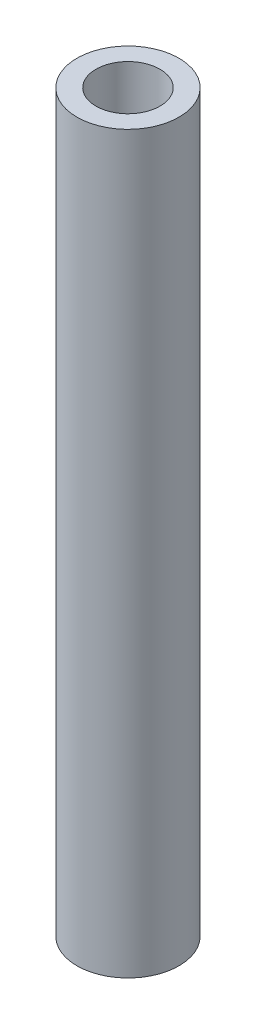
ISO-10303-21;
HEADER;
FILE_DESCRIPTION(('STEP AP214'),'2;1');
FILE_NAME('part.step','',(''),(''),'','','');
FILE_SCHEMA(('AUTOMOTIVE_DESIGN { 1 0 10303 214 1 1 1 1 }'));
ENDSEC;
DATA;
#1=APPLICATION_CONTEXT('core data for automotive mechanical design processes');
#2=APPLICATION_PROTOCOL_DEFINITION('international standard','automotive_design',2000,#1);
#3=PRODUCT_CONTEXT('',#1,'mechanical');
#4=PRODUCT('Part','Part','',(#3));
#5=PRODUCT_RELATED_PRODUCT_CATEGORY('part','',(#4));
#6=PRODUCT_DEFINITION_FORMATION('','',#4);
#7=PRODUCT_DEFINITION_CONTEXT('part definition',#1,'design');
#8=PRODUCT_DEFINITION('design','',#6,#7);
#9=PRODUCT_DEFINITION_SHAPE('','',#8);
#10=(LENGTH_UNIT() NAMED_UNIT(*) SI_UNIT(.MILLI.,.METRE.));
#11=(NAMED_UNIT(*) PLANE_ANGLE_UNIT() SI_UNIT($,.RADIAN.));
#12=(NAMED_UNIT(*) SI_UNIT($,.STERADIAN.) SOLID_ANGLE_UNIT());
#13=UNCERTAINTY_MEASURE_WITH_UNIT(LENGTH_MEASURE(1.E-05),#10,'distance_accuracy_value','');
#14=(GEOMETRIC_REPRESENTATION_CONTEXT(3) GLOBAL_UNCERTAINTY_ASSIGNED_CONTEXT((#13)) GLOBAL_UNIT_ASSIGNED_CONTEXT((#10,
#11,#12)) REPRESENTATION_CONTEXT('',''));
#15=CARTESIAN_POINT('',(0.,0.,0.));
#16=DIRECTION('',(0.,0.,1.));
#17=DIRECTION('',(1.,0.,0.));
#18=AXIS2_PLACEMENT_3D('',#15,#16,#17);
#19=CARTESIAN_POINT('',(0.,28.575,0.));
#20=DIRECTION('',(0.,1.,0.));
#21=DIRECTION('',(0.,0.,1.));
#22=AXIS2_PLACEMENT_3D('',#19,#20,#21);
#23=PLANE('',#22);
#24=CARTESIAN_POINT('',(0.,28.575,0.));
#25=DIRECTION('',(0.,1.,0.));
#26=DIRECTION('',(0.,0.,1.));
#27=AXIS2_PLACEMENT_3D('',#24,#25,#26);
#28=CIRCLE('',#27,3.96875);
#29=CARTESIAN_POINT('',(0.,28.575,3.96875));
#30=VERTEX_POINT('',#29);
#31=EDGE_CURVE('E10',#30,#30,#28,.T.);
#32=ORIENTED_EDGE('',*,*,#31,.T.);
#33=EDGE_LOOP('',(#32));
#34=FACE_BOUND('',#33,.T.);
#35=CARTESIAN_POINT('',(0.,28.575,0.));
#36=DIRECTION('',(0.,1.,0.));
#37=DIRECTION('',(0.,0.,1.));
#38=AXIS2_PLACEMENT_3D('',#35,#36,#37);
#39=CIRCLE('',#38,2.4892);
#40=CARTESIAN_POINT('',(0.,28.575,2.4892));
#41=VERTEX_POINT('',#40);
#42=EDGE_CURVE('E50',#41,#41,#39,.T.);
#43=ORIENTED_EDGE('',*,*,#42,.F.);
#44=EDGE_LOOP('',(#43));
#45=FACE_BOUND('',#44,.T.);
#46=ADVANCED_FACE('F37',(#34,#45),#23,.T.);
#47=CARTESIAN_POINT('',(0.,-28.575,0.));
#48=DIRECTION('',(0.,1.,0.));
#49=DIRECTION('',(0.,0.,1.));
#50=AXIS2_PLACEMENT_3D('',#47,#48,#49);
#51=PLANE('',#50);
#52=CARTESIAN_POINT('',(0.,-28.575,0.));
#53=DIRECTION('',(0.,1.,0.));
#54=DIRECTION('',(0.,0.,1.));
#55=AXIS2_PLACEMENT_3D('',#52,#53,#54);
#56=CIRCLE('',#55,3.96875);
#57=CARTESIAN_POINT('',(0.,-28.575,3.96875));
#58=VERTEX_POINT('',#57);
#59=EDGE_CURVE('E41',#58,#58,#56,.T.);
#60=ORIENTED_EDGE('',*,*,#59,.F.);
#61=EDGE_LOOP('',(#60));
#62=FACE_BOUND('',#61,.T.);
#63=CARTESIAN_POINT('',(0.,-28.575,0.));
#64=DIRECTION('',(0.,1.,0.));
#65=DIRECTION('',(0.,0.,1.));
#66=AXIS2_PLACEMENT_3D('',#63,#64,#65);
#67=CIRCLE('',#66,2.4892);
#68=CARTESIAN_POINT('',(0.,-28.575,2.4892));
#69=VERTEX_POINT('',#68);
#70=EDGE_CURVE('E52',#69,#69,#67,.T.);
#71=ORIENTED_EDGE('',*,*,#70,.T.);
#72=EDGE_LOOP('',(#71));
#73=FACE_BOUND('',#72,.T.);
#74=ADVANCED_FACE('F64',(#62,#73),#51,.F.);
#75=CARTESIAN_POINT('',(0.,28.575,0.));
#76=DIRECTION('',(0.,-1.,0.));
#77=DIRECTION('',(0.,0.,-1.));
#78=AXIS2_PLACEMENT_3D('',#75,#76,#77);
#79=CYLINDRICAL_SURFACE('',#78,3.96875);
#80=ORIENTED_EDGE('',*,*,#31,.F.);
#81=EDGE_LOOP('',(#80));
#82=FACE_BOUND('',#81,.T.);
#83=ORIENTED_EDGE('',*,*,#59,.T.);
#84=EDGE_LOOP('',(#83));
#85=FACE_BOUND('',#84,.T.);
#86=ADVANCED_FACE('F39',(#82,#85),#79,.T.);
#87=CARTESIAN_POINT('',(0.,28.575,0.));
#88=DIRECTION('',(0.,-1.,0.));
#89=DIRECTION('',(0.,0.,-1.));
#90=AXIS2_PLACEMENT_3D('',#87,#88,#89);
#91=CYLINDRICAL_SURFACE('',#90,2.4892);
#92=ORIENTED_EDGE('',*,*,#42,.T.);
#93=EDGE_LOOP('',(#92));
#94=FACE_BOUND('',#93,.T.);
#95=ORIENTED_EDGE('',*,*,#70,.F.);
#96=EDGE_LOOP('',(#95));
#97=FACE_BOUND('',#96,.T.);
#98=ADVANCED_FACE('F60',(#94,#97),#91,.F.);
#99=CLOSED_SHELL('',(#46,#74,#86,#98));
#100=MANIFOLD_SOLID_BREP('B2',#99);
#101=ADVANCED_BREP_SHAPE_REPRESENTATION('',(#18,#100),#14);
#102=SHAPE_DEFINITION_REPRESENTATION(#9,#101);
ENDSEC;
END-ISO-10303-21;
